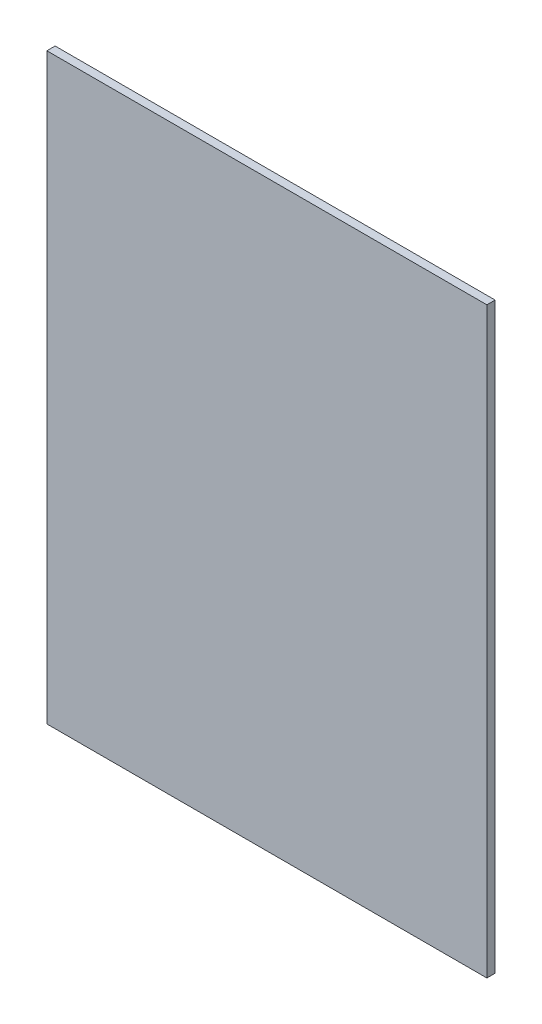
ISO-10303-21;
HEADER;
FILE_DESCRIPTION(('STEP AP214'),'2;1');
FILE_NAME('part.step','',(''),(''),'','','');
FILE_SCHEMA(('AUTOMOTIVE_DESIGN { 1 0 10303 214 1 1 1 1 }'));
ENDSEC;
DATA;
#1=APPLICATION_CONTEXT('core data for automotive mechanical design processes');
#2=APPLICATION_PROTOCOL_DEFINITION('international standard','automotive_design',2000,#1);
#3=PRODUCT_CONTEXT('',#1,'mechanical');
#4=PRODUCT('Part','Part','',(#3));
#5=PRODUCT_RELATED_PRODUCT_CATEGORY('part','',(#4));
#6=PRODUCT_DEFINITION_FORMATION('','',#4);
#7=PRODUCT_DEFINITION_CONTEXT('part definition',#1,'design');
#8=PRODUCT_DEFINITION('design','',#6,#7);
#9=PRODUCT_DEFINITION_SHAPE('','',#8);
#10=(LENGTH_UNIT() NAMED_UNIT(*) SI_UNIT(.MILLI.,.METRE.));
#11=(NAMED_UNIT(*) PLANE_ANGLE_UNIT() SI_UNIT($,.RADIAN.));
#12=(NAMED_UNIT(*) SI_UNIT($,.STERADIAN.) SOLID_ANGLE_UNIT());
#13=UNCERTAINTY_MEASURE_WITH_UNIT(LENGTH_MEASURE(1.E-05),#10,'distance_accuracy_value','');
#14=(GEOMETRIC_REPRESENTATION_CONTEXT(3) GLOBAL_UNCERTAINTY_ASSIGNED_CONTEXT((#13)) GLOBAL_UNIT_ASSIGNED_CONTEXT((#10,
#11,#12)) REPRESENTATION_CONTEXT('',''));
#15=CARTESIAN_POINT('',(0.,0.,0.));
#16=DIRECTION('',(0.,0.,1.));
#17=DIRECTION('',(1.,0.,0.));
#18=AXIS2_PLACEMENT_3D('',#15,#16,#17);
#19=CARTESIAN_POINT('',(80.,-106.,1.5));
#20=DIRECTION('',(-1.,0.,0.));
#21=DIRECTION('',(0.,0.,1.));
#22=AXIS2_PLACEMENT_3D('',#19,#20,#21);
#23=PLANE('',#22);
#24=DIRECTION('',(0.,1.,0.));
#25=VECTOR('',#24,1.);
#26=CARTESIAN_POINT('',(80.,-106.,-1.5));
#27=LINE('',#26,#25);
#28=CARTESIAN_POINT('',(80.,-106.,-1.5));
#29=VERTEX_POINT('',#28);
#30=CARTESIAN_POINT('',(80.,106.,-1.5));
#31=VERTEX_POINT('',#30);
#32=EDGE_CURVE('E96',#29,#31,#27,.T.);
#33=ORIENTED_EDGE('',*,*,#32,.T.);
#34=DIRECTION('',(0.,0.,-1.));
#35=VECTOR('',#34,1.);
#36=CARTESIAN_POINT('',(80.,106.,1.5));
#37=LINE('',#36,#35);
#38=CARTESIAN_POINT('',(80.,106.,1.5));
#39=VERTEX_POINT('',#38);
#40=EDGE_CURVE('E11',#39,#31,#37,.T.);
#41=ORIENTED_EDGE('',*,*,#40,.F.);
#42=DIRECTION('',(0.,1.,0.));
#43=VECTOR('',#42,1.);
#44=CARTESIAN_POINT('',(80.,-106.,1.5));
#45=LINE('',#44,#43);
#46=CARTESIAN_POINT('',(80.,-106.,1.5));
#47=VERTEX_POINT('',#46);
#48=EDGE_CURVE('E84',#47,#39,#45,.T.);
#49=ORIENTED_EDGE('',*,*,#48,.F.);
#50=DIRECTION('',(0.,0.,-1.));
#51=VECTOR('',#50,1.);
#52=CARTESIAN_POINT('',(80.,-106.,1.5));
#53=LINE('',#52,#51);
#54=EDGE_CURVE('E92',#47,#29,#53,.T.);
#55=ORIENTED_EDGE('',*,*,#54,.T.);
#56=EDGE_LOOP('',(#33,#41,#49,#55));
#57=FACE_BOUND('',#56,.T.);
#58=ADVANCED_FACE('F33',(#57),#23,.F.);
#59=CARTESIAN_POINT('',(-80.,106.,1.5));
#60=DIRECTION('',(0.,-1.,0.));
#61=DIRECTION('',(0.,0.,-1.));
#62=AXIS2_PLACEMENT_3D('',#59,#60,#61);
#63=PLANE('',#62);
#64=DIRECTION('',(-1.,0.,0.));
#65=VECTOR('',#64,1.);
#66=CARTESIAN_POINT('',(-80.,106.,-1.5));
#67=LINE('',#66,#65);
#68=CARTESIAN_POINT('',(-80.,106.,-1.5));
#69=VERTEX_POINT('',#68);
#70=EDGE_CURVE('E88',#31,#69,#67,.T.);
#71=ORIENTED_EDGE('',*,*,#70,.T.);
#72=DIRECTION('',(0.,0.,-1.));
#73=VECTOR('',#72,1.);
#74=CARTESIAN_POINT('',(-80.,106.,1.5));
#75=LINE('',#74,#73);
#76=CARTESIAN_POINT('',(-80.,106.,1.5));
#77=VERTEX_POINT('',#76);
#78=EDGE_CURVE('E41',#77,#69,#75,.T.);
#79=ORIENTED_EDGE('',*,*,#78,.F.);
#80=DIRECTION('',(-1.,0.,0.));
#81=VECTOR('',#80,1.);
#82=CARTESIAN_POINT('',(-80.,106.,1.5));
#83=LINE('',#82,#81);
#84=EDGE_CURVE('E79',#39,#77,#83,.T.);
#85=ORIENTED_EDGE('',*,*,#84,.F.);
#86=ORIENTED_EDGE('',*,*,#40,.T.);
#87=EDGE_LOOP('',(#71,#79,#85,#86));
#88=FACE_BOUND('',#87,.T.);
#89=ADVANCED_FACE('F87',(#88),#63,.F.);
#90=CARTESIAN_POINT('',(-80.,-106.,1.5));
#91=DIRECTION('',(1.,0.,0.));
#92=DIRECTION('',(0.,0.,-1.));
#93=AXIS2_PLACEMENT_3D('',#90,#91,#92);
#94=PLANE('',#93);
#95=DIRECTION('',(0.,-1.,0.));
#96=VECTOR('',#95,1.);
#97=CARTESIAN_POINT('',(-80.,-106.,-1.5));
#98=LINE('',#97,#96);
#99=CARTESIAN_POINT('',(-80.,-106.,-1.5));
#100=VERTEX_POINT('',#99);
#101=EDGE_CURVE('E66',#69,#100,#98,.T.);
#102=ORIENTED_EDGE('',*,*,#101,.T.);
#103=DIRECTION('',(0.,0.,-1.));
#104=VECTOR('',#103,1.);
#105=CARTESIAN_POINT('',(-80.,-106.,1.5));
#106=LINE('',#105,#104);
#107=CARTESIAN_POINT('',(-80.,-106.,1.5));
#108=VERTEX_POINT('',#107);
#109=EDGE_CURVE('E89',#108,#100,#106,.T.);
#110=ORIENTED_EDGE('',*,*,#109,.F.);
#111=DIRECTION('',(0.,-1.,0.));
#112=VECTOR('',#111,1.);
#113=CARTESIAN_POINT('',(-80.,-106.,1.5));
#114=LINE('',#113,#112);
#115=EDGE_CURVE('E82',#77,#108,#114,.T.);
#116=ORIENTED_EDGE('',*,*,#115,.F.);
#117=ORIENTED_EDGE('',*,*,#78,.T.);
#118=EDGE_LOOP('',(#102,#110,#116,#117));
#119=FACE_BOUND('',#118,.T.);
#120=ADVANCED_FACE('F90',(#119),#94,.F.);
#121=CARTESIAN_POINT('',(-80.,-106.,1.5));
#122=DIRECTION('',(0.,1.,0.));
#123=DIRECTION('',(0.,0.,1.));
#124=AXIS2_PLACEMENT_3D('',#121,#122,#123);
#125=PLANE('',#124);
#126=DIRECTION('',(1.,0.,0.));
#127=VECTOR('',#126,1.);
#128=CARTESIAN_POINT('',(-80.,-106.,-1.5));
#129=LINE('',#128,#127);
#130=EDGE_CURVE('E72',#100,#29,#129,.T.);
#131=ORIENTED_EDGE('',*,*,#130,.T.);
#132=ORIENTED_EDGE('',*,*,#54,.F.);
#133=DIRECTION('',(1.,0.,0.));
#134=VECTOR('',#133,1.);
#135=CARTESIAN_POINT('',(-80.,-106.,1.5));
#136=LINE('',#135,#134);
#137=EDGE_CURVE('E49',#108,#47,#136,.T.);
#138=ORIENTED_EDGE('',*,*,#137,.F.);
#139=ORIENTED_EDGE('',*,*,#109,.T.);
#140=EDGE_LOOP('',(#131,#132,#138,#139));
#141=FACE_BOUND('',#140,.T.);
#142=ADVANCED_FACE('F103',(#141),#125,.F.);
#143=CARTESIAN_POINT('',(0.,0.,1.5));
#144=DIRECTION('',(0.,0.,-1.));
#145=DIRECTION('',(-1.,0.,0.));
#146=AXIS2_PLACEMENT_3D('',#143,#144,#145);
#147=PLANE('',#146);
#148=ORIENTED_EDGE('',*,*,#48,.T.);
#149=ORIENTED_EDGE('',*,*,#84,.T.);
#150=ORIENTED_EDGE('',*,*,#115,.T.);
#151=ORIENTED_EDGE('',*,*,#137,.T.);
#152=EDGE_LOOP('',(#148,#149,#150,#151));
#153=FACE_BOUND('',#152,.T.);
#154=ADVANCED_FACE('F80',(#153),#147,.F.);
#155=CARTESIAN_POINT('',(0.,0.,-1.5));
#156=DIRECTION('',(0.,0.,-1.));
#157=DIRECTION('',(-1.,0.,0.));
#158=AXIS2_PLACEMENT_3D('',#155,#156,#157);
#159=PLANE('',#158);
#160=ORIENTED_EDGE('',*,*,#32,.F.);
#161=ORIENTED_EDGE('',*,*,#130,.F.);
#162=ORIENTED_EDGE('',*,*,#101,.F.);
#163=ORIENTED_EDGE('',*,*,#70,.F.);
#164=EDGE_LOOP('',(#160,#161,#162,#163));
#165=FACE_BOUND('',#164,.T.);
#166=ADVANCED_FACE('F106',(#165),#159,.T.);
#167=CLOSED_SHELL('',(#58,#89,#120,#142,#154,#166));
#168=MANIFOLD_SOLID_BREP('B2',#167);
#169=ADVANCED_BREP_SHAPE_REPRESENTATION('',(#18,#168),#14);
#170=SHAPE_DEFINITION_REPRESENTATION(#9,#169);
ENDSEC;
END-ISO-10303-21;
